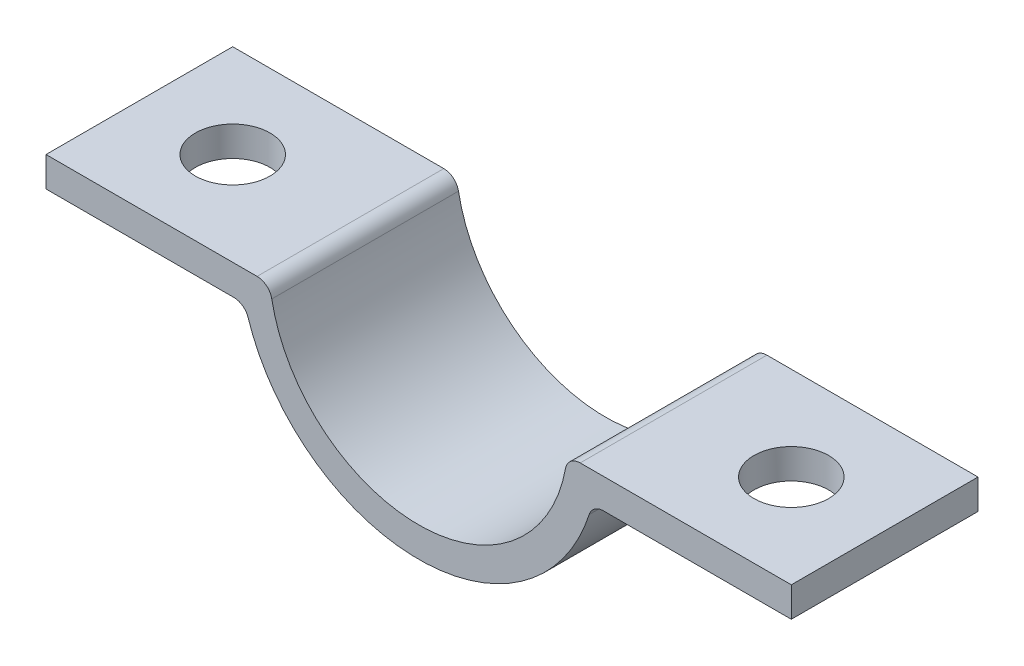
ISO-10303-21;
HEADER;
FILE_DESCRIPTION(('STEP AP214'),'2;1');
FILE_NAME('part.step','',(''),(''),'','','');
FILE_SCHEMA(('AUTOMOTIVE_DESIGN { 1 0 10303 214 1 1 1 1 }'));
ENDSEC;
DATA;
#1=APPLICATION_CONTEXT('core data for automotive mechanical design processes');
#2=APPLICATION_PROTOCOL_DEFINITION('international standard','automotive_design',2000,#1);
#3=PRODUCT_CONTEXT('',#1,'mechanical');
#4=PRODUCT('Part','Part','',(#3));
#5=PRODUCT_RELATED_PRODUCT_CATEGORY('part','',(#4));
#6=PRODUCT_DEFINITION_FORMATION('','',#4);
#7=PRODUCT_DEFINITION_CONTEXT('part definition',#1,'design');
#8=PRODUCT_DEFINITION('design','',#6,#7);
#9=PRODUCT_DEFINITION_SHAPE('','',#8);
#10=(LENGTH_UNIT() NAMED_UNIT(*) SI_UNIT(.MILLI.,.METRE.));
#11=(NAMED_UNIT(*) PLANE_ANGLE_UNIT() SI_UNIT($,.RADIAN.));
#12=(NAMED_UNIT(*) SI_UNIT($,.STERADIAN.) SOLID_ANGLE_UNIT());
#13=UNCERTAINTY_MEASURE_WITH_UNIT(LENGTH_MEASURE(1.E-05),#10,'distance_accuracy_value','');
#14=(GEOMETRIC_REPRESENTATION_CONTEXT(3) GLOBAL_UNCERTAINTY_ASSIGNED_CONTEXT((#13)) GLOBAL_UNIT_ASSIGNED_CONTEXT((#10,
#11,#12)) REPRESENTATION_CONTEXT('',''));
#15=CARTESIAN_POINT('',(0.,0.,0.));
#16=DIRECTION('',(0.,0.,1.));
#17=DIRECTION('',(1.,0.,0.));
#18=AXIS2_PLACEMENT_3D('',#15,#16,#17);
#19=CARTESIAN_POINT('',(24.9498743710662,19.0173195198486,12.5));
#20=DIRECTION('',(-1.,0.,0.));
#21=DIRECTION('',(0.,0.,1.));
#22=AXIS2_PLACEMENT_3D('',#19,#20,#21);
#23=PLANE('',#22);
#24=DIRECTION('',(0.,1.,0.));
#25=VECTOR('',#24,1.);
#26=CARTESIAN_POINT('',(24.9498743710662,19.0173195198486,0.));
#27=LINE('',#26,#25);
#28=CARTESIAN_POINT('',(24.9498743710662,17.0173195198486,0.));
#29=VERTEX_POINT('',#28);
#30=CARTESIAN_POINT('',(24.9498743710662,19.0173195198486,0.));
#31=VERTEX_POINT('',#30);
#32=EDGE_CURVE('E172',#29,#31,#27,.T.);
#33=ORIENTED_EDGE('',*,*,#32,.T.);
#34=DIRECTION('',(0.,0.,-1.));
#35=VECTOR('',#34,1.);
#36=CARTESIAN_POINT('',(24.9498743710662,19.0173195198486,12.5));
#37=LINE('',#36,#35);
#38=CARTESIAN_POINT('',(24.9498743710662,19.0173195198486,12.5));
#39=VERTEX_POINT('',#38);
#40=EDGE_CURVE('E52',#39,#31,#37,.T.);
#41=ORIENTED_EDGE('',*,*,#40,.F.);
#42=DIRECTION('',(0.,1.,0.));
#43=VECTOR('',#42,1.);
#44=CARTESIAN_POINT('',(24.9498743710662,19.0173195198486,12.5));
#45=LINE('',#44,#43);
#46=CARTESIAN_POINT('',(24.9498743710662,17.0173195198486,12.5));
#47=VERTEX_POINT('',#46);
#48=EDGE_CURVE('E116',#47,#39,#45,.T.);
#49=ORIENTED_EDGE('',*,*,#48,.F.);
#50=DIRECTION('',(0.,0.,-1.));
#51=VECTOR('',#50,1.);
#52=CARTESIAN_POINT('',(24.9498743710662,17.0173195198486,12.5));
#53=LINE('',#52,#51);
#54=EDGE_CURVE('E11',#47,#29,#53,.T.);
#55=ORIENTED_EDGE('',*,*,#54,.T.);
#56=EDGE_LOOP('',(#33,#41,#49,#55));
#57=FACE_BOUND('',#56,.T.);
#58=ADVANCED_FACE('F43',(#57),#23,.F.);
#59=CARTESIAN_POINT('',(10.816653826392,19.0173195198486,12.5));
#60=DIRECTION('',(0.,-1.,0.));
#61=DIRECTION('',(0.,0.,-1.));
#62=AXIS2_PLACEMENT_3D('',#59,#60,#61);
#63=PLANE('',#62);
#64=CARTESIAN_POINT('',(18.6998743710661,19.0173195198487,6.25));
#65=DIRECTION('',(0.,1.,0.));
#66=DIRECTION('',(0.,0.,-1.));
#67=AXIS2_PLACEMENT_3D('',#64,#65,#66);
#68=CIRCLE('',#67,2.5);
#69=CARTESIAN_POINT('',(18.6998743710661,19.0173195198487,3.74999999999999));
#70=VERTEX_POINT('',#69);
#71=EDGE_CURVE('E399',#70,#70,#68,.T.);
#72=ORIENTED_EDGE('',*,*,#71,.F.);
#73=EDGE_LOOP('',(#72));
#74=FACE_BOUND('',#73,.T.);
#75=DIRECTION('',(-1.,0.,0.));
#76=VECTOR('',#75,1.);
#77=CARTESIAN_POINT('',(10.816653826392,19.0173195198486,0.));
#78=LINE('',#77,#76);
#79=CARTESIAN_POINT('',(10.816653826392,19.0173195198486,0.));
#80=VERTEX_POINT('',#79);
#81=EDGE_CURVE('E176',#31,#80,#78,.T.);
#82=ORIENTED_EDGE('',*,*,#81,.T.);
#83=DIRECTION('',(0.,0.,-1.));
#84=VECTOR('',#83,1.);
#85=CARTESIAN_POINT('',(10.816653826392,19.0173195198486,12.5));
#86=LINE('',#85,#84);
#87=CARTESIAN_POINT('',(10.816653826392,19.0173195198486,12.5));
#88=VERTEX_POINT('',#87);
#89=EDGE_CURVE('E235',#88,#80,#86,.T.);
#90=ORIENTED_EDGE('',*,*,#89,.F.);
#91=DIRECTION('',(-1.,0.,0.));
#92=VECTOR('',#91,1.);
#93=CARTESIAN_POINT('',(19.9498743710662,19.0173195198486,12.5));
#94=LINE('',#93,#92);
#95=EDGE_CURVE('E244',#39,#88,#94,.T.);
#96=ORIENTED_EDGE('',*,*,#95,.F.);
#97=ORIENTED_EDGE('',*,*,#40,.T.);
#98=EDGE_LOOP('',(#82,#90,#96,#97));
#99=FACE_BOUND('',#98,.T.);
#100=ADVANCED_FACE('F242',(#74,#99),#63,.F.);
#101=CARTESIAN_POINT('',(10.816653826392,18.0173195198486,12.5));
#102=DIRECTION('',(0.,0.,-1.));
#103=DIRECTION('',(-1.,0.,0.));
#104=AXIS2_PLACEMENT_3D('',#101,#102,#103);
#105=CYLINDRICAL_SURFACE('',#104,1.);
#106=CARTESIAN_POINT('',(10.816653826392,18.0173195198486,0.));
#107=DIRECTION('',(0.,0.,1.));
#108=DIRECTION('',(1.,0.,0.));
#109=AXIS2_PLACEMENT_3D('',#106,#107,#108);
#110=CIRCLE('',#109,1.);
#111=CARTESIAN_POINT('',(9.83332166035634,18.1991377016668,0.));
#112=VERTEX_POINT('',#111);
#113=EDGE_CURVE('E180',#80,#112,#110,.T.);
#114=ORIENTED_EDGE('',*,*,#113,.T.);
#115=DIRECTION('',(0.,0.,-1.));
#116=VECTOR('',#115,1.);
#117=CARTESIAN_POINT('',(9.83332166035634,18.1991377016668,12.5));
#118=LINE('',#117,#116);
#119=CARTESIAN_POINT('',(9.83332166035634,18.1991377016668,12.5));
#120=VERTEX_POINT('',#119);
#121=EDGE_CURVE('E231',#120,#112,#118,.T.);
#122=ORIENTED_EDGE('',*,*,#121,.F.);
#123=CARTESIAN_POINT('',(10.816653826392,18.0173195198486,12.5));
#124=DIRECTION('',(0.,0.,1.));
#125=DIRECTION('',(1.,0.,0.));
#126=AXIS2_PLACEMENT_3D('',#123,#124,#125);
#127=CIRCLE('',#126,1.);
#128=EDGE_CURVE('E264',#88,#120,#127,.T.);
#129=ORIENTED_EDGE('',*,*,#128,.F.);
#130=ORIENTED_EDGE('',*,*,#89,.T.);
#131=EDGE_LOOP('',(#114,#122,#129,#130));
#132=FACE_BOUND('',#131,.T.);
#133=ADVANCED_FACE('F254',(#132),#105,.T.);
#134=CARTESIAN_POINT('',(0.,20.0173195198486,12.5));
#135=DIRECTION('',(0.,0.,-1.));
#136=DIRECTION('',(-1.,0.,0.));
#137=AXIS2_PLACEMENT_3D('',#134,#135,#136);
#138=CYLINDRICAL_SURFACE('',#137,10.);
#139=CARTESIAN_POINT('',(0.,20.0173195198486,0.));
#140=DIRECTION('',(0.,0.,-1.));
#141=DIRECTION('',(1.,0.,0.));
#142=AXIS2_PLACEMENT_3D('',#139,#140,#141);
#143=CIRCLE('',#142,10.);
#144=CARTESIAN_POINT('',(-9.83332166035634,18.1991377016668,0.));
#145=VERTEX_POINT('',#144);
#146=EDGE_CURVE('E183',#112,#145,#143,.T.);
#147=ORIENTED_EDGE('',*,*,#146,.T.);
#148=DIRECTION('',(0.,0.,-1.));
#149=VECTOR('',#148,1.);
#150=CARTESIAN_POINT('',(-9.83332166035634,18.1991377016668,12.5));
#151=LINE('',#150,#149);
#152=CARTESIAN_POINT('',(-9.83332166035634,18.1991377016668,12.5));
#153=VERTEX_POINT('',#152);
#154=EDGE_CURVE('E227',#153,#145,#151,.T.);
#155=ORIENTED_EDGE('',*,*,#154,.F.);
#156=CARTESIAN_POINT('',(0.,20.0173195198486,12.5));
#157=DIRECTION('',(0.,0.,-1.));
#158=DIRECTION('',(1.,0.,0.));
#159=AXIS2_PLACEMENT_3D('',#156,#157,#158);
#160=CIRCLE('',#159,10.);
#161=EDGE_CURVE('E260',#120,#153,#160,.T.);
#162=ORIENTED_EDGE('',*,*,#161,.F.);
#163=ORIENTED_EDGE('',*,*,#121,.T.);
#164=EDGE_LOOP('',(#147,#155,#162,#163));
#165=FACE_BOUND('',#164,.T.);
#166=ADVANCED_FACE('F258',(#165),#138,.F.);
#167=CARTESIAN_POINT('',(-10.816653826392,18.0173195198486,12.5));
#168=DIRECTION('',(0.,0.,-1.));
#169=DIRECTION('',(-1.,0.,0.));
#170=AXIS2_PLACEMENT_3D('',#167,#168,#169);
#171=CYLINDRICAL_SURFACE('',#170,1.);
#172=CARTESIAN_POINT('',(-10.816653826392,18.0173195198486,0.));
#173=DIRECTION('',(0.,0.,1.));
#174=DIRECTION('',(-1.,0.,0.));
#175=AXIS2_PLACEMENT_3D('',#172,#173,#174);
#176=CIRCLE('',#175,1.);
#177=CARTESIAN_POINT('',(-10.816653826392,19.0173195198486,0.));
#178=VERTEX_POINT('',#177);
#179=EDGE_CURVE('E186',#145,#178,#176,.T.);
#180=ORIENTED_EDGE('',*,*,#179,.T.);
#181=DIRECTION('',(0.,0.,-1.));
#182=VECTOR('',#181,1.);
#183=CARTESIAN_POINT('',(-10.816653826392,19.0173195198486,12.5));
#184=LINE('',#183,#182);
#185=CARTESIAN_POINT('',(-10.816653826392,19.0173195198486,12.5));
#186=VERTEX_POINT('',#185);
#187=EDGE_CURVE('E223',#186,#178,#184,.T.);
#188=ORIENTED_EDGE('',*,*,#187,.F.);
#189=CARTESIAN_POINT('',(-10.816653826392,18.0173195198486,12.5));
#190=DIRECTION('',(0.,0.,1.));
#191=DIRECTION('',(-1.,0.,0.));
#192=AXIS2_PLACEMENT_3D('',#189,#190,#191);
#193=CIRCLE('',#192,1.);
#194=EDGE_CURVE('E263',#153,#186,#193,.T.);
#195=ORIENTED_EDGE('',*,*,#194,.F.);
#196=ORIENTED_EDGE('',*,*,#154,.T.);
#197=EDGE_LOOP('',(#180,#188,#195,#196));
#198=FACE_BOUND('',#197,.T.);
#199=ADVANCED_FACE('F290',(#198),#171,.T.);
#200=CARTESIAN_POINT('',(-19.9498743710662,19.0173195198486,12.5));
#201=DIRECTION('',(0.,-1.,0.));
#202=DIRECTION('',(1.,0.,0.));
#203=AXIS2_PLACEMENT_3D('',#200,#201,#202);
#204=PLANE('',#203);
#205=CARTESIAN_POINT('',(-18.6998743710662,19.0173195198487,6.25));
#206=DIRECTION('',(0.,1.,0.));
#207=DIRECTION('',(0.,0.,1.));
#208=AXIS2_PLACEMENT_3D('',#205,#206,#207);
#209=CIRCLE('',#208,2.5);
#210=CARTESIAN_POINT('',(-18.6998743710662,19.0173195198487,8.75));
#211=VERTEX_POINT('',#210);
#212=EDGE_CURVE('E393',#211,#211,#209,.T.);
#213=ORIENTED_EDGE('',*,*,#212,.F.);
#214=EDGE_LOOP('',(#213));
#215=FACE_BOUND('',#214,.T.);
#216=DIRECTION('',(-1.,0.,0.));
#217=VECTOR('',#216,1.);
#218=CARTESIAN_POINT('',(-19.9498743710662,19.0173195198486,0.));
#219=LINE('',#218,#217);
#220=CARTESIAN_POINT('',(-24.9498743710662,19.0173195198486,0.));
#221=VERTEX_POINT('',#220);
#222=EDGE_CURVE('E190',#178,#221,#219,.T.);
#223=ORIENTED_EDGE('',*,*,#222,.T.);
#224=DIRECTION('',(0.,0.,-1.));
#225=VECTOR('',#224,1.);
#226=CARTESIAN_POINT('',(-24.9498743710662,19.0173195198486,12.5));
#227=LINE('',#226,#225);
#228=CARTESIAN_POINT('',(-24.9498743710662,19.0173195198486,12.5));
#229=VERTEX_POINT('',#228);
#230=EDGE_CURVE('E219',#229,#221,#227,.T.);
#231=ORIENTED_EDGE('',*,*,#230,.F.);
#232=DIRECTION('',(-1.,0.,0.));
#233=VECTOR('',#232,1.);
#234=CARTESIAN_POINT('',(-10.816653826392,19.0173195198486,12.5));
#235=LINE('',#234,#233);
#236=EDGE_CURVE('E268',#186,#229,#235,.T.);
#237=ORIENTED_EDGE('',*,*,#236,.F.);
#238=ORIENTED_EDGE('',*,*,#187,.T.);
#239=EDGE_LOOP('',(#223,#231,#237,#238));
#240=FACE_BOUND('',#239,.T.);
#241=ADVANCED_FACE('F291',(#215,#240),#204,.F.);
#242=CARTESIAN_POINT('',(-24.9498743710662,19.0173195198486,12.5));
#243=DIRECTION('',(1.,0.,0.));
#244=DIRECTION('',(0.,0.,-1.));
#245=AXIS2_PLACEMENT_3D('',#242,#243,#244);
#246=PLANE('',#245);
#247=DIRECTION('',(0.,-1.,0.));
#248=VECTOR('',#247,1.);
#249=CARTESIAN_POINT('',(-24.9498743710662,19.0173195198486,0.));
#250=LINE('',#249,#248);
#251=CARTESIAN_POINT('',(-24.9498743710662,17.0173195198486,0.));
#252=VERTEX_POINT('',#251);
#253=EDGE_CURVE('E193',#221,#252,#250,.T.);
#254=ORIENTED_EDGE('',*,*,#253,.T.);
#255=DIRECTION('',(0.,0.,-1.));
#256=VECTOR('',#255,1.);
#257=CARTESIAN_POINT('',(-24.9498743710662,17.0173195198486,12.5));
#258=LINE('',#257,#256);
#259=CARTESIAN_POINT('',(-24.9498743710662,17.0173195198486,12.5));
#260=VERTEX_POINT('',#259);
#261=EDGE_CURVE('E215',#260,#252,#258,.T.);
#262=ORIENTED_EDGE('',*,*,#261,.F.);
#263=DIRECTION('',(0.,-1.,0.));
#264=VECTOR('',#263,1.);
#265=CARTESIAN_POINT('',(-24.9498743710662,19.0173195198486,12.5));
#266=LINE('',#265,#264);
#267=EDGE_CURVE('E275',#229,#260,#266,.T.);
#268=ORIENTED_EDGE('',*,*,#267,.F.);
#269=ORIENTED_EDGE('',*,*,#230,.T.);
#270=EDGE_LOOP('',(#254,#262,#268,#269));
#271=FACE_BOUND('',#270,.T.);
#272=ADVANCED_FACE('F283',(#271),#246,.F.);
#273=CARTESIAN_POINT('',(-19.9498743710662,17.0173195198486,12.5));
#274=DIRECTION('',(0.,1.,0.));
#275=DIRECTION('',(0.,0.,1.));
#276=AXIS2_PLACEMENT_3D('',#273,#274,#275);
#277=PLANE('',#276);
#278=CARTESIAN_POINT('',(-18.6998743710662,17.0173195198486,6.25));
#279=DIRECTION('',(0.,1.,0.));
#280=DIRECTION('',(0.,0.,1.));
#281=AXIS2_PLACEMENT_3D('',#278,#279,#280);
#282=CIRCLE('',#281,2.5);
#283=CARTESIAN_POINT('',(-18.6998743710662,17.0173195198486,8.75));
#284=VERTEX_POINT('',#283);
#285=EDGE_CURVE('E177',#284,#284,#282,.F.);
#286=ORIENTED_EDGE('',*,*,#285,.F.);
#287=EDGE_LOOP('',(#286));
#288=FACE_BOUND('',#287,.T.);
#289=DIRECTION('',(1.,0.,0.));
#290=VECTOR('',#289,1.);
#291=CARTESIAN_POINT('',(-19.9498743710662,17.0173195198486,0.));
#292=LINE('',#291,#290);
#293=CARTESIAN_POINT('',(-12.369316876853,17.0173195198486,0.));
#294=VERTEX_POINT('',#293);
#295=EDGE_CURVE('E197',#252,#294,#292,.T.);
#296=ORIENTED_EDGE('',*,*,#295,.T.);
#297=DIRECTION('',(0.,0.,-1.));
#298=VECTOR('',#297,1.);
#299=CARTESIAN_POINT('',(-12.369316876853,17.0173195198486,12.5));
#300=LINE('',#299,#298);
#301=CARTESIAN_POINT('',(-12.369316876853,17.0173195198486,12.5));
#302=VERTEX_POINT('',#301);
#303=EDGE_CURVE('E159',#302,#294,#300,.T.);
#304=ORIENTED_EDGE('',*,*,#303,.F.);
#305=DIRECTION('',(1.,0.,0.));
#306=VECTOR('',#305,1.);
#307=CARTESIAN_POINT('',(-24.9498743710662,17.0173195198486,12.5));
#308=LINE('',#307,#306);
#309=EDGE_CURVE('E148',#260,#302,#308,.T.);
#310=ORIENTED_EDGE('',*,*,#309,.F.);
#311=ORIENTED_EDGE('',*,*,#261,.T.);
#312=EDGE_LOOP('',(#296,#304,#310,#311));
#313=FACE_BOUND('',#312,.T.);
#314=ADVANCED_FACE('F286',(#288,#313),#277,.F.);
#315=CARTESIAN_POINT('',(-12.369316876853,16.0173195198486,12.5));
#316=DIRECTION('',(0.,0.,-1.));
#317=DIRECTION('',(-1.,0.,0.));
#318=AXIS2_PLACEMENT_3D('',#315,#316,#317);
#319=CYLINDRICAL_SURFACE('',#318,1.);
#320=CARTESIAN_POINT('',(-12.369316876853,16.0173195198486,0.));
#321=DIRECTION('',(0.,0.,-1.));
#322=DIRECTION('',(-1.,0.,0.));
#323=AXIS2_PLACEMENT_3D('',#320,#321,#322);
#324=CIRCLE('',#323,1.);
#325=CARTESIAN_POINT('',(-11.4178309632489,16.3250118275409,0.));
#326=VERTEX_POINT('',#325);
#327=EDGE_CURVE('E157',#294,#326,#324,.T.);
#328=ORIENTED_EDGE('',*,*,#327,.T.);
#329=DIRECTION('',(0.,0.,-1.));
#330=VECTOR('',#329,1.);
#331=CARTESIAN_POINT('',(-11.4178309632489,16.3250118275409,12.5));
#332=LINE('',#331,#330);
#333=CARTESIAN_POINT('',(-11.4178309632489,16.3250118275409,12.5));
#334=VERTEX_POINT('',#333);
#335=EDGE_CURVE('E154',#334,#326,#332,.T.);
#336=ORIENTED_EDGE('',*,*,#335,.F.);
#337=CARTESIAN_POINT('',(-12.369316876853,16.0173195198486,12.5));
#338=DIRECTION('',(0.,0.,-1.));
#339=DIRECTION('',(-1.,0.,0.));
#340=AXIS2_PLACEMENT_3D('',#337,#338,#339);
#341=CIRCLE('',#340,1.);
#342=EDGE_CURVE('E142',#302,#334,#341,.T.);
#343=ORIENTED_EDGE('',*,*,#342,.F.);
#344=ORIENTED_EDGE('',*,*,#303,.T.);
#345=EDGE_LOOP('',(#328,#336,#343,#344));
#346=FACE_BOUND('',#345,.T.);
#347=ADVANCED_FACE('F155',(#346),#319,.F.);
#348=CARTESIAN_POINT('',(0.,20.0173195198486,12.5));
#349=DIRECTION('',(0.,0.,-1.));
#350=DIRECTION('',(-1.,0.,0.));
#351=AXIS2_PLACEMENT_3D('',#348,#349,#350);
#352=CYLINDRICAL_SURFACE('',#351,12.);
#353=CARTESIAN_POINT('',(0.,20.0173195198486,0.));
#354=DIRECTION('',(0.,0.,1.));
#355=DIRECTION('',(1.,0.,0.));
#356=AXIS2_PLACEMENT_3D('',#353,#354,#355);
#357=CIRCLE('',#356,12.);
#358=CARTESIAN_POINT('',(11.4178309632489,16.3250118275409,0.));
#359=VERTEX_POINT('',#358);
#360=EDGE_CURVE('E102',#326,#359,#357,.T.);
#361=ORIENTED_EDGE('',*,*,#360,.T.);
#362=DIRECTION('',(0.,0.,-1.));
#363=VECTOR('',#362,1.);
#364=CARTESIAN_POINT('',(11.4178309632489,16.3250118275409,12.5));
#365=LINE('',#364,#363);
#366=CARTESIAN_POINT('',(11.4178309632489,16.3250118275409,12.5));
#367=VERTEX_POINT('',#366);
#368=EDGE_CURVE('E160',#367,#359,#365,.T.);
#369=ORIENTED_EDGE('',*,*,#368,.F.);
#370=CARTESIAN_POINT('',(0.,20.0173195198486,12.5));
#371=DIRECTION('',(0.,0.,1.));
#372=DIRECTION('',(1.,0.,0.));
#373=AXIS2_PLACEMENT_3D('',#370,#371,#372);
#374=CIRCLE('',#373,12.);
#375=EDGE_CURVE('E146',#334,#367,#374,.T.);
#376=ORIENTED_EDGE('',*,*,#375,.F.);
#377=ORIENTED_EDGE('',*,*,#335,.T.);
#378=EDGE_LOOP('',(#361,#369,#376,#377));
#379=FACE_BOUND('',#378,.T.);
#380=ADVANCED_FACE('F162',(#379),#352,.T.);
#381=CARTESIAN_POINT('',(12.369316876853,16.0173195198486,12.5));
#382=DIRECTION('',(0.,0.,-1.));
#383=DIRECTION('',(-1.,0.,0.));
#384=AXIS2_PLACEMENT_3D('',#381,#382,#383);
#385=CYLINDRICAL_SURFACE('',#384,1.);
#386=CARTESIAN_POINT('',(12.369316876853,16.0173195198486,0.));
#387=DIRECTION('',(0.,0.,-1.));
#388=DIRECTION('',(1.,0.,0.));
#389=AXIS2_PLACEMENT_3D('',#386,#387,#388);
#390=CIRCLE('',#389,1.);
#391=CARTESIAN_POINT('',(12.369316876853,17.0173195198486,0.));
#392=VERTEX_POINT('',#391);
#393=EDGE_CURVE('E109',#359,#392,#390,.T.);
#394=ORIENTED_EDGE('',*,*,#393,.T.);
#395=DIRECTION('',(0.,0.,-1.));
#396=VECTOR('',#395,1.);
#397=CARTESIAN_POINT('',(12.369316876853,17.0173195198486,12.5));
#398=LINE('',#397,#396);
#399=CARTESIAN_POINT('',(12.369316876853,17.0173195198486,12.5));
#400=VERTEX_POINT('',#399);
#401=EDGE_CURVE('E168',#400,#392,#398,.T.);
#402=ORIENTED_EDGE('',*,*,#401,.F.);
#403=CARTESIAN_POINT('',(12.369316876853,16.0173195198486,12.5));
#404=DIRECTION('',(0.,0.,-1.));
#405=DIRECTION('',(1.,0.,0.));
#406=AXIS2_PLACEMENT_3D('',#403,#404,#405);
#407=CIRCLE('',#406,1.);
#408=EDGE_CURVE('E165',#367,#400,#407,.T.);
#409=ORIENTED_EDGE('',*,*,#408,.F.);
#410=ORIENTED_EDGE('',*,*,#368,.T.);
#411=EDGE_LOOP('',(#394,#402,#409,#410));
#412=FACE_BOUND('',#411,.T.);
#413=ADVANCED_FACE('F343',(#412),#385,.F.);
#414=CARTESIAN_POINT('',(19.9498743710662,17.0173195198486,12.5));
#415=DIRECTION('',(0.,1.,0.));
#416=DIRECTION('',(0.,0.,1.));
#417=AXIS2_PLACEMENT_3D('',#414,#415,#416);
#418=PLANE('',#417);
#419=CARTESIAN_POINT('',(18.6998743710661,17.0173195198486,6.25));
#420=DIRECTION('',(0.,1.,0.));
#421=DIRECTION('',(0.,0.,1.));
#422=AXIS2_PLACEMENT_3D('',#419,#420,#421);
#423=CIRCLE('',#422,2.5);
#424=CARTESIAN_POINT('',(18.6998743710661,17.0173195198486,8.75));
#425=VERTEX_POINT('',#424);
#426=EDGE_CURVE('E396',#425,#425,#423,.F.);
#427=ORIENTED_EDGE('',*,*,#426,.F.);
#428=EDGE_LOOP('',(#427));
#429=FACE_BOUND('',#428,.T.);
#430=DIRECTION('',(1.,0.,0.));
#431=VECTOR('',#430,1.);
#432=CARTESIAN_POINT('',(19.9498743710662,17.0173195198486,0.));
#433=LINE('',#432,#431);
#434=EDGE_CURVE('E206',#392,#29,#433,.T.);
#435=ORIENTED_EDGE('',*,*,#434,.T.);
#436=ORIENTED_EDGE('',*,*,#54,.F.);
#437=DIRECTION('',(1.,0.,0.));
#438=VECTOR('',#437,1.);
#439=CARTESIAN_POINT('',(24.9498743710662,17.0173195198486,12.5));
#440=LINE('',#439,#438);
#441=EDGE_CURVE('E60',#400,#47,#440,.T.);
#442=ORIENTED_EDGE('',*,*,#441,.F.);
#443=ORIENTED_EDGE('',*,*,#401,.T.);
#444=EDGE_LOOP('',(#435,#436,#442,#443));
#445=FACE_BOUND('',#444,.T.);
#446=ADVANCED_FACE('F350',(#429,#445),#418,.F.);
#447=CARTESIAN_POINT('',(12.369316876853,16.0173195198486,12.5));
#448=DIRECTION('',(0.,0.,1.));
#449=DIRECTION('',(1.,0.,0.));
#450=AXIS2_PLACEMENT_3D('',#447,#448,#449);
#451=PLANE('',#450);
#452=ORIENTED_EDGE('',*,*,#441,.T.);
#453=ORIENTED_EDGE('',*,*,#48,.T.);
#454=ORIENTED_EDGE('',*,*,#95,.T.);
#455=ORIENTED_EDGE('',*,*,#128,.T.);
#456=ORIENTED_EDGE('',*,*,#161,.T.);
#457=ORIENTED_EDGE('',*,*,#194,.T.);
#458=ORIENTED_EDGE('',*,*,#236,.T.);
#459=ORIENTED_EDGE('',*,*,#267,.T.);
#460=ORIENTED_EDGE('',*,*,#309,.T.);
#461=ORIENTED_EDGE('',*,*,#342,.T.);
#462=ORIENTED_EDGE('',*,*,#375,.T.);
#463=ORIENTED_EDGE('',*,*,#408,.T.);
#464=EDGE_LOOP('',(#452,#453,#454,#455,#456,#457,#458,#459,#460,#461,#462,#463));
#465=FACE_BOUND('',#464,.T.);
#466=ADVANCED_FACE('F144',(#465),#451,.T.);
#467=CARTESIAN_POINT('',(12.369316876853,16.0173195198486,0.));
#468=DIRECTION('',(0.,0.,1.));
#469=DIRECTION('',(1.,0.,0.));
#470=AXIS2_PLACEMENT_3D('',#467,#468,#469);
#471=PLANE('',#470);
#472=ORIENTED_EDGE('',*,*,#32,.F.);
#473=ORIENTED_EDGE('',*,*,#434,.F.);
#474=ORIENTED_EDGE('',*,*,#393,.F.);
#475=ORIENTED_EDGE('',*,*,#360,.F.);
#476=ORIENTED_EDGE('',*,*,#327,.F.);
#477=ORIENTED_EDGE('',*,*,#295,.F.);
#478=ORIENTED_EDGE('',*,*,#253,.F.);
#479=ORIENTED_EDGE('',*,*,#222,.F.);
#480=ORIENTED_EDGE('',*,*,#179,.F.);
#481=ORIENTED_EDGE('',*,*,#146,.F.);
#482=ORIENTED_EDGE('',*,*,#113,.F.);
#483=ORIENTED_EDGE('',*,*,#81,.F.);
#484=EDGE_LOOP('',(#472,#473,#474,#475,#476,#477,#478,#479,#480,#481,#482,#483));
#485=FACE_BOUND('',#484,.T.);
#486=ADVANCED_FACE('F248',(#485),#471,.F.);
#487=CARTESIAN_POINT('',(18.6998743710661,8.01631951984864,6.25));
#488=DIRECTION('',(0.,1.,0.));
#489=DIRECTION('',(0.,0.,1.));
#490=AXIS2_PLACEMENT_3D('',#487,#488,#489);
#491=CYLINDRICAL_SURFACE('',#490,2.5);
#492=ORIENTED_EDGE('',*,*,#71,.T.);
#493=EDGE_LOOP('',(#492));
#494=FACE_BOUND('',#493,.T.);
#495=ORIENTED_EDGE('',*,*,#426,.T.);
#496=EDGE_LOOP('',(#495));
#497=FACE_BOUND('',#496,.T.);
#498=ADVANCED_FACE('F363',(#494,#497),#491,.F.);
#499=CARTESIAN_POINT('',(-18.6998743710662,8.01631951984864,6.25));
#500=DIRECTION('',(0.,1.,0.));
#501=DIRECTION('',(0.,0.,1.));
#502=AXIS2_PLACEMENT_3D('',#499,#500,#501);
#503=CYLINDRICAL_SURFACE('',#502,2.5);
#504=ORIENTED_EDGE('',*,*,#212,.T.);
#505=EDGE_LOOP('',(#504));
#506=FACE_BOUND('',#505,.T.);
#507=ORIENTED_EDGE('',*,*,#285,.T.);
#508=EDGE_LOOP('',(#507));
#509=FACE_BOUND('',#508,.T.);
#510=ADVANCED_FACE('F372',(#506,#509),#503,.F.);
#511=CLOSED_SHELL('',(#58,#100,#133,#166,#199,#241,#272,#314,#347,#380,#413,#446,#466,#486,#498,#510));
#512=MANIFOLD_SOLID_BREP('B2',#511);
#513=ADVANCED_BREP_SHAPE_REPRESENTATION('',(#18,#512),#14);
#514=SHAPE_DEFINITION_REPRESENTATION(#9,#513);
ENDSEC;
END-ISO-10303-21;
